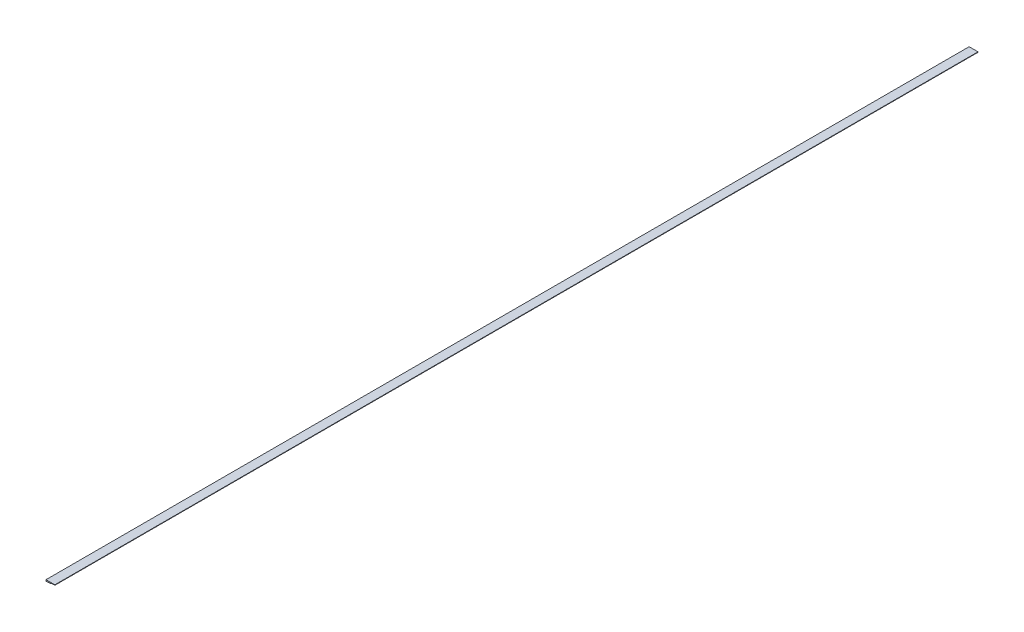
ISO-10303-21;
HEADER;
FILE_DESCRIPTION(('STEP AP214'),'2;1');
FILE_NAME('part.step','',(''),(''),'','','');
FILE_SCHEMA(('AUTOMOTIVE_DESIGN { 1 0 10303 214 1 1 1 1 }'));
ENDSEC;
DATA;
#1=APPLICATION_CONTEXT('core data for automotive mechanical design processes');
#2=APPLICATION_PROTOCOL_DEFINITION('international standard','automotive_design',2000,#1);
#3=PRODUCT_CONTEXT('',#1,'mechanical');
#4=PRODUCT('Part','Part','',(#3));
#5=PRODUCT_RELATED_PRODUCT_CATEGORY('part','',(#4));
#6=PRODUCT_DEFINITION_FORMATION('','',#4);
#7=PRODUCT_DEFINITION_CONTEXT('part definition',#1,'design');
#8=PRODUCT_DEFINITION('design','',#6,#7);
#9=PRODUCT_DEFINITION_SHAPE('','',#8);
#10=(LENGTH_UNIT() NAMED_UNIT(*) SI_UNIT(.MILLI.,.METRE.));
#11=(NAMED_UNIT(*) PLANE_ANGLE_UNIT() SI_UNIT($,.RADIAN.));
#12=(NAMED_UNIT(*) SI_UNIT($,.STERADIAN.) SOLID_ANGLE_UNIT());
#13=UNCERTAINTY_MEASURE_WITH_UNIT(LENGTH_MEASURE(1.E-05),#10,'distance_accuracy_value','');
#14=(GEOMETRIC_REPRESENTATION_CONTEXT(3) GLOBAL_UNCERTAINTY_ASSIGNED_CONTEXT((#13)) GLOBAL_UNIT_ASSIGNED_CONTEXT((#10,
#11,#12)) REPRESENTATION_CONTEXT('',''));
#15=CARTESIAN_POINT('',(0.,0.,0.));
#16=DIRECTION('',(0.,0.,1.));
#17=DIRECTION('',(1.,0.,0.));
#18=AXIS2_PLACEMENT_3D('',#15,#16,#17);
#19=CARTESIAN_POINT('',(-7.61942410712193,25.3999999999964,-5265.01611975518));
#20=DIRECTION('',(-2.02768685480261E-11,-1.,0.));
#21=DIRECTION('',(1.,-2.02768685480261E-11,0.));
#22=AXIS2_PLACEMENT_3D('',#19,#20,#21);
#23=PLANE('',#22);
#24=DIRECTION('',(-1.,2.02768685480261E-11,0.));
#25=VECTOR('',#24,1.);
#26=CARTESIAN_POINT('',(-7.61942410712193,25.3999999999964,-5214.39999999999));
#27=LINE('',#26,#25);
#28=CARTESIAN_POINT('',(-4.44442410709883,25.399999999932,-5214.39999999999));
#29=VERTEX_POINT('',#28);
#30=CARTESIAN_POINT('',(-7.61942410712193,25.3999999999964,-5214.39999999999));
#31=VERTEX_POINT('',#30);
#32=EDGE_CURVE('E43',#29,#31,#27,.T.);
#33=ORIENTED_EDGE('',*,*,#32,.F.);
#34=DIRECTION('',(0.,0.,1.));
#35=VECTOR('',#34,1.);
#36=CARTESIAN_POINT('',(-4.44442410709883,25.399999999932,-5265.01611975518));
#37=LINE('',#36,#35);
#38=CARTESIAN_POINT('',(-4.44442410709883,25.399999999932,0.));
#39=VERTEX_POINT('',#38);
#40=EDGE_CURVE('E88',#29,#39,#37,.T.);
#41=ORIENTED_EDGE('',*,*,#40,.T.);
#42=DIRECTION('',(1.,-2.02768685480261E-11,0.));
#43=VECTOR('',#42,1.);
#44=CARTESIAN_POINT('',(-7.61942410712193,25.3999999999964,0.));
#45=LINE('',#44,#43);
#46=CARTESIAN_POINT('',(-7.61942410712193,25.3999999999964,0.));
#47=VERTEX_POINT('',#46);
#48=EDGE_CURVE('E92',#47,#39,#45,.T.);
#49=ORIENTED_EDGE('',*,*,#48,.F.);
#50=DIRECTION('',(0.,0.,1.));
#51=VECTOR('',#50,1.);
#52=CARTESIAN_POINT('',(-7.61942410712193,25.3999999999964,-5265.01611975518));
#53=LINE('',#52,#51);
#54=EDGE_CURVE('E125',#31,#47,#53,.T.);
#55=ORIENTED_EDGE('',*,*,#54,.F.);
#56=EDGE_LOOP('',(#33,#41,#49,#55));
#57=FACE_BOUND('',#56,.T.);
#58=ADVANCED_FACE('F35',(#57),#23,.T.);
#59=CARTESIAN_POINT('',(-7.61942410712193,25.3999999999964,-5265.01611975518));
#60=DIRECTION('',(0.0871557427458573,-0.996194698091903,0.));
#61=DIRECTION('',(0.996194698091903,0.0871557427458573,0.));
#62=AXIS2_PLACEMENT_3D('',#59,#60,#61);
#63=PLANE('',#62);
#64=DIRECTION('',(-0.996194698091903,-0.0871557427458573,0.));
#65=VECTOR('',#64,1.);
#66=CARTESIAN_POINT('',(-7.61942410712194,25.3999999999964,-5214.39999999999));
#67=LINE('',#66,#65);
#68=CARTESIAN_POINT('',(-32.6194241071219,23.2127834118938,-5214.39999999999));
#69=VERTEX_POINT('',#68);
#70=EDGE_CURVE('E158',#31,#69,#67,.T.);
#71=ORIENTED_EDGE('',*,*,#70,.F.);
#72=ORIENTED_EDGE('',*,*,#54,.T.);
#73=DIRECTION('',(0.996194698091903,0.0871557427458573,0.));
#74=VECTOR('',#73,1.);
#75=CARTESIAN_POINT('',(-7.61942410712193,25.3999999999964,0.));
#76=LINE('',#75,#74);
#77=CARTESIAN_POINT('',(-32.6194241071219,23.2127834118938,0.));
#78=VERTEX_POINT('',#77);
#79=EDGE_CURVE('E98',#78,#47,#76,.T.);
#80=ORIENTED_EDGE('',*,*,#79,.F.);
#81=DIRECTION('',(0.,0.,1.));
#82=VECTOR('',#81,1.);
#83=CARTESIAN_POINT('',(-32.6194241071219,23.2127834118938,-5265.01611975518));
#84=LINE('',#83,#82);
#85=EDGE_CURVE('E128',#69,#78,#84,.T.);
#86=ORIENTED_EDGE('',*,*,#85,.F.);
#87=EDGE_LOOP('',(#71,#72,#80,#86));
#88=FACE_BOUND('',#87,.T.);
#89=ADVANCED_FACE('F157',(#88),#63,.T.);
#90=CARTESIAN_POINT('',(-32.6194241071219,31.0862565381194,-5265.01611975518));
#91=DIRECTION('',(-1.,0.,0.));
#92=DIRECTION('',(0.,0.,1.));
#93=AXIS2_PLACEMENT_3D('',#90,#91,#92);
#94=PLANE('',#93);
#95=DIRECTION('',(0.,1.,0.));
#96=VECTOR('',#95,1.);
#97=CARTESIAN_POINT('',(-32.6194241071219,31.0862565381193,-5214.39999999999));
#98=LINE('',#97,#96);
#99=CARTESIAN_POINT('',(-32.6194241071219,31.0862565381194,-5214.39999999999));
#100=VERTEX_POINT('',#99);
#101=EDGE_CURVE('E154',#69,#100,#98,.T.);
#102=ORIENTED_EDGE('',*,*,#101,.F.);
#103=ORIENTED_EDGE('',*,*,#85,.T.);
#104=DIRECTION('',(0.,-1.,0.));
#105=VECTOR('',#104,1.);
#106=CARTESIAN_POINT('',(-32.6194241071219,31.0862565381194,0.));
#107=LINE('',#106,#105);
#108=CARTESIAN_POINT('',(-32.6194241071219,31.0862565381194,0.));
#109=VERTEX_POINT('',#108);
#110=EDGE_CURVE('E122',#109,#78,#107,.T.);
#111=ORIENTED_EDGE('',*,*,#110,.F.);
#112=DIRECTION('',(0.,0.,1.));
#113=VECTOR('',#112,1.);
#114=CARTESIAN_POINT('',(-32.6194241071219,31.0862565381194,-5265.01611975518));
#115=LINE('',#114,#113);
#116=EDGE_CURVE('E130',#100,#109,#115,.T.);
#117=ORIENTED_EDGE('',*,*,#116,.F.);
#118=EDGE_LOOP('',(#102,#103,#111,#117));
#119=FACE_BOUND('',#118,.T.);
#120=ADVANCED_FACE('F152',(#119),#94,.T.);
#121=CARTESIAN_POINT('',(17.3805758928781,31.0862565381195,-5265.01611975518));
#122=DIRECTION('',(0.,1.,0.));
#123=DIRECTION('',(-1.,0.,0.));
#124=AXIS2_PLACEMENT_3D('',#121,#122,#123);
#125=PLANE('',#124);
#126=DIRECTION('',(1.,0.,0.));
#127=VECTOR('',#126,1.);
#128=CARTESIAN_POINT('',(17.3805758928781,31.0862565381195,-5214.39999999999));
#129=LINE('',#128,#127);
#130=CARTESIAN_POINT('',(17.3805758928781,31.0862565381195,-5214.39999999999));
#131=VERTEX_POINT('',#130);
#132=EDGE_CURVE('E149',#100,#131,#129,.T.);
#133=ORIENTED_EDGE('',*,*,#132,.F.);
#134=ORIENTED_EDGE('',*,*,#116,.T.);
#135=DIRECTION('',(-1.,0.,0.));
#136=VECTOR('',#135,1.);
#137=CARTESIAN_POINT('',(17.3805758928781,31.0862565381195,0.));
#138=LINE('',#137,#136);
#139=CARTESIAN_POINT('',(17.3805758928781,31.0862565381195,0.));
#140=VERTEX_POINT('',#139);
#141=EDGE_CURVE('E119',#140,#109,#138,.T.);
#142=ORIENTED_EDGE('',*,*,#141,.F.);
#143=DIRECTION('',(0.,0.,1.));
#144=VECTOR('',#143,1.);
#145=CARTESIAN_POINT('',(17.3805758928781,31.0862565381195,-5265.01611975518));
#146=LINE('',#145,#144);
#147=EDGE_CURVE('E132',#131,#140,#146,.T.);
#148=ORIENTED_EDGE('',*,*,#147,.F.);
#149=EDGE_LOOP('',(#133,#134,#142,#148));
#150=FACE_BOUND('',#149,.T.);
#151=ADVANCED_FACE('F147',(#150),#125,.T.);
#152=CARTESIAN_POINT('',(17.3805758929012,28.574999999932,-5265.01611975518));
#153=DIRECTION('',(1.,9.19565108583875E-12,0.));
#154=DIRECTION('',(-9.19565108583875E-12,1.,0.));
#155=AXIS2_PLACEMENT_3D('',#152,#153,#154);
#156=PLANE('',#155);
#157=DIRECTION('',(9.19565108583875E-12,-1.,0.));
#158=VECTOR('',#157,1.);
#159=CARTESIAN_POINT('',(17.3805758929012,28.5749999999318,-5214.39999999999));
#160=LINE('',#159,#158);
#161=CARTESIAN_POINT('',(17.3805758929012,28.574999999932,-5214.39999999999));
#162=VERTEX_POINT('',#161);
#163=EDGE_CURVE('E50',#131,#162,#160,.T.);
#164=ORIENTED_EDGE('',*,*,#163,.F.);
#165=ORIENTED_EDGE('',*,*,#147,.T.);
#166=DIRECTION('',(-9.19565108583874E-12,1.,0.));
#167=VECTOR('',#166,1.);
#168=CARTESIAN_POINT('',(17.3805758929012,28.574999999932,0.));
#169=LINE('',#168,#167);
#170=CARTESIAN_POINT('',(17.3805758929012,28.574999999932,0.));
#171=VERTEX_POINT('',#170);
#172=EDGE_CURVE('E116',#171,#140,#169,.T.);
#173=ORIENTED_EDGE('',*,*,#172,.F.);
#174=DIRECTION('',(0.,0.,1.));
#175=VECTOR('',#174,1.);
#176=CARTESIAN_POINT('',(17.3805758929012,28.574999999932,-5265.01611975518));
#177=LINE('',#176,#175);
#178=EDGE_CURVE('E134',#162,#171,#177,.T.);
#179=ORIENTED_EDGE('',*,*,#178,.F.);
#180=EDGE_LOOP('',(#164,#165,#173,#179));
#181=FACE_BOUND('',#180,.T.);
#182=ADVANCED_FACE('F141',(#181),#156,.T.);
#183=CARTESIAN_POINT('',(-4.44442410709883,28.574999999932,-5265.01611975518));
#184=DIRECTION('',(0.,-1.,0.));
#185=DIRECTION('',(0.,0.,-1.));
#186=AXIS2_PLACEMENT_3D('',#183,#184,#185);
#187=PLANE('',#186);
#188=DIRECTION('',(-1.,0.,0.));
#189=VECTOR('',#188,1.);
#190=CARTESIAN_POINT('',(-4.44442410709883,28.574999999932,-5214.39999999999));
#191=LINE('',#190,#189);
#192=CARTESIAN_POINT('',(-4.44442410709883,28.574999999932,-5214.39999999999));
#193=VERTEX_POINT('',#192);
#194=EDGE_CURVE('E127',#162,#193,#191,.T.);
#195=ORIENTED_EDGE('',*,*,#194,.F.);
#196=ORIENTED_EDGE('',*,*,#178,.T.);
#197=DIRECTION('',(1.,0.,0.));
#198=VECTOR('',#197,1.);
#199=CARTESIAN_POINT('',(-4.44442410709883,28.574999999932,0.));
#200=LINE('',#199,#198);
#201=CARTESIAN_POINT('',(-4.44442410709883,28.574999999932,0.));
#202=VERTEX_POINT('',#201);
#203=EDGE_CURVE('E106',#202,#171,#200,.T.);
#204=ORIENTED_EDGE('',*,*,#203,.F.);
#205=DIRECTION('',(0.,0.,1.));
#206=VECTOR('',#205,1.);
#207=CARTESIAN_POINT('',(-4.44442410709883,28.574999999932,-5265.01611975518));
#208=LINE('',#207,#206);
#209=EDGE_CURVE('E97',#193,#202,#208,.T.);
#210=ORIENTED_EDGE('',*,*,#209,.F.);
#211=EDGE_LOOP('',(#195,#196,#204,#210));
#212=FACE_BOUND('',#211,.T.);
#213=ADVANCED_FACE('F139',(#212),#187,.T.);
#214=CARTESIAN_POINT('',(-4.44442410709883,25.399999999932,-5265.01611975518));
#215=DIRECTION('',(1.,0.,0.));
#216=DIRECTION('',(0.,0.,-1.));
#217=AXIS2_PLACEMENT_3D('',#214,#215,#216);
#218=PLANE('',#217);
#219=DIRECTION('',(0.,-1.,0.));
#220=VECTOR('',#219,1.);
#221=CARTESIAN_POINT('',(-4.44442410709883,25.3999999999318,-5214.39999999999));
#222=LINE('',#221,#220);
#223=EDGE_CURVE('E11',#193,#29,#222,.T.);
#224=ORIENTED_EDGE('',*,*,#223,.F.);
#225=ORIENTED_EDGE('',*,*,#209,.T.);
#226=DIRECTION('',(0.,1.,0.));
#227=VECTOR('',#226,1.);
#228=CARTESIAN_POINT('',(-4.44442410709883,25.399999999932,0.));
#229=LINE('',#228,#227);
#230=EDGE_CURVE('E100',#39,#202,#229,.T.);
#231=ORIENTED_EDGE('',*,*,#230,.F.);
#232=ORIENTED_EDGE('',*,*,#40,.F.);
#233=EDGE_LOOP('',(#224,#225,#231,#232));
#234=FACE_BOUND('',#233,.T.);
#235=ADVANCED_FACE('F101',(#234),#218,.T.);
#236=CARTESIAN_POINT('',(0.,0.,0.));
#237=DIRECTION('',(0.,0.,1.));
#238=DIRECTION('',(1.,0.,0.));
#239=AXIS2_PLACEMENT_3D('',#236,#237,#238);
#240=PLANE('',#239);
#241=ORIENTED_EDGE('',*,*,#48,.T.);
#242=ORIENTED_EDGE('',*,*,#230,.T.);
#243=ORIENTED_EDGE('',*,*,#203,.T.);
#244=ORIENTED_EDGE('',*,*,#172,.T.);
#245=ORIENTED_EDGE('',*,*,#141,.T.);
#246=ORIENTED_EDGE('',*,*,#110,.T.);
#247=ORIENTED_EDGE('',*,*,#79,.T.);
#248=EDGE_LOOP('',(#241,#242,#243,#244,#245,#246,#247));
#249=FACE_BOUND('',#248,.T.);
#250=ADVANCED_FACE('F108',(#249),#240,.T.);
#251=CARTESIAN_POINT('',(-2103.00317746498,-160.701499757388,-5214.39999999999));
#252=DIRECTION('',(0.,0.,1.));
#253=DIRECTION('',(-0.0871557427476582,0.996194698091746,0.));
#254=AXIS2_PLACEMENT_3D('',#251,#252,#253);
#255=PLANE('',#254);
#256=ORIENTED_EDGE('',*,*,#32,.T.);
#257=ORIENTED_EDGE('',*,*,#70,.T.);
#258=ORIENTED_EDGE('',*,*,#101,.T.);
#259=ORIENTED_EDGE('',*,*,#132,.T.);
#260=ORIENTED_EDGE('',*,*,#163,.T.);
#261=ORIENTED_EDGE('',*,*,#194,.T.);
#262=ORIENTED_EDGE('',*,*,#223,.T.);
#263=EDGE_LOOP('',(#256,#257,#258,#259,#260,#261,#262));
#264=FACE_BOUND('',#263,.T.);
#265=ADVANCED_FACE('F159',(#264),#255,.F.);
#266=CLOSED_SHELL('',(#58,#89,#120,#151,#182,#213,#235,#250,#265));
#267=MANIFOLD_SOLID_BREP('B2',#266);
#268=ADVANCED_BREP_SHAPE_REPRESENTATION('',(#18,#267),#14);
#269=SHAPE_DEFINITION_REPRESENTATION(#9,#268);
ENDSEC;
END-ISO-10303-21;
